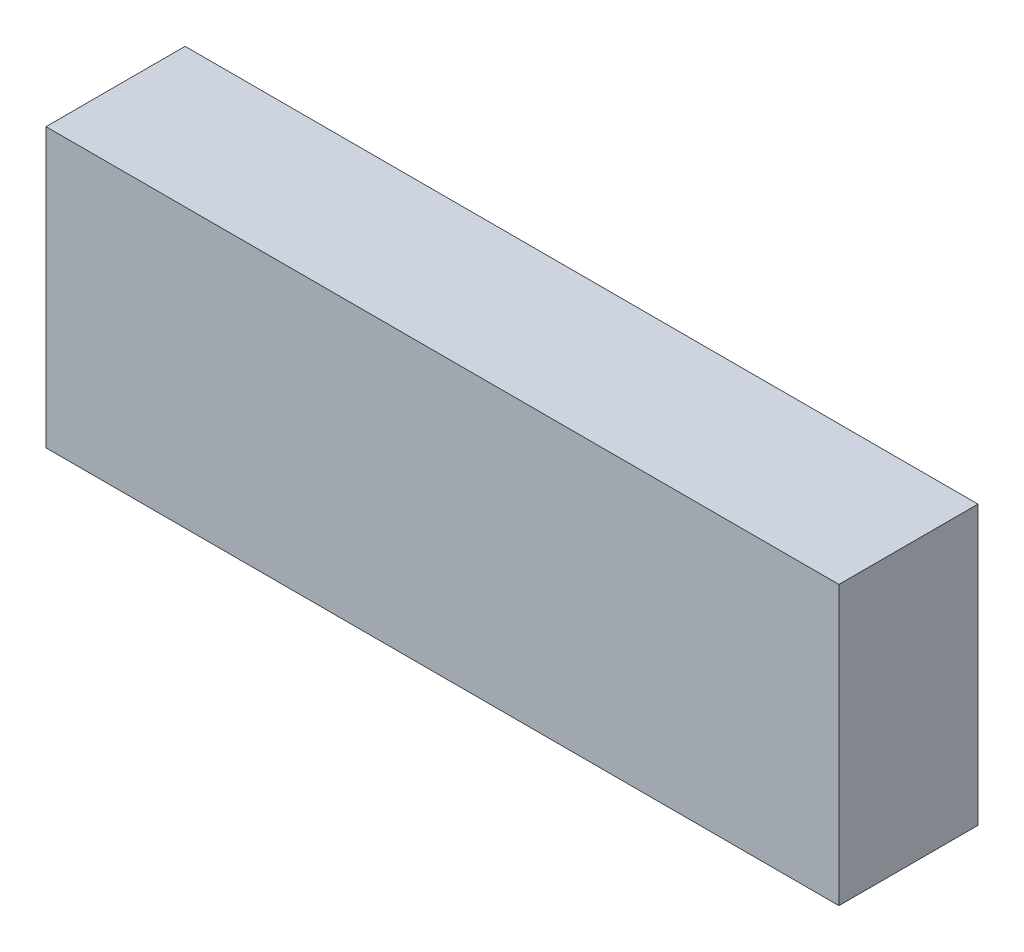
ISO-10303-21;
HEADER;
FILE_DESCRIPTION(('STEP AP214'),'2;1');
FILE_NAME('part.step','',(''),(''),'','','');
FILE_SCHEMA(('AUTOMOTIVE_DESIGN { 1 0 10303 214 1 1 1 1 }'));
ENDSEC;
DATA;
#1=APPLICATION_CONTEXT('core data for automotive mechanical design processes');
#2=APPLICATION_PROTOCOL_DEFINITION('international standard','automotive_design',2000,#1);
#3=PRODUCT_CONTEXT('',#1,'mechanical');
#4=PRODUCT('Part','Part','',(#3));
#5=PRODUCT_RELATED_PRODUCT_CATEGORY('part','',(#4));
#6=PRODUCT_DEFINITION_FORMATION('','',#4);
#7=PRODUCT_DEFINITION_CONTEXT('part definition',#1,'design');
#8=PRODUCT_DEFINITION('design','',#6,#7);
#9=PRODUCT_DEFINITION_SHAPE('','',#8);
#10=(LENGTH_UNIT() NAMED_UNIT(*) SI_UNIT(.MILLI.,.METRE.));
#11=(NAMED_UNIT(*) PLANE_ANGLE_UNIT() SI_UNIT($,.RADIAN.));
#12=(NAMED_UNIT(*) SI_UNIT($,.STERADIAN.) SOLID_ANGLE_UNIT());
#13=UNCERTAINTY_MEASURE_WITH_UNIT(LENGTH_MEASURE(1.E-05),#10,'distance_accuracy_value','');
#14=(GEOMETRIC_REPRESENTATION_CONTEXT(3) GLOBAL_UNCERTAINTY_ASSIGNED_CONTEXT((#13)) GLOBAL_UNIT_ASSIGNED_CONTEXT((#10,
#11,#12)) REPRESENTATION_CONTEXT('',''));
#15=CARTESIAN_POINT('',(0.,0.,0.));
#16=DIRECTION('',(0.,0.,1.));
#17=DIRECTION('',(1.,0.,0.));
#18=AXIS2_PLACEMENT_3D('',#15,#16,#17);
#19=CARTESIAN_POINT('',(0.,0.,10.));
#20=DIRECTION('',(1.,0.,0.));
#21=DIRECTION('',(0.,0.,-1.));
#22=AXIS2_PLACEMENT_3D('',#19,#20,#21);
#23=PLANE('',#22);
#24=DIRECTION('',(0.,-1.,0.));
#25=VECTOR('',#24,1.);
#26=CARTESIAN_POINT('',(0.,0.,0.));
#27=LINE('',#26,#25);
#28=CARTESIAN_POINT('',(0.,20.,0.));
#29=VERTEX_POINT('',#28);
#30=CARTESIAN_POINT('',(0.,0.,0.));
#31=VERTEX_POINT('',#30);
#32=EDGE_CURVE('E106',#29,#31,#27,.T.);
#33=ORIENTED_EDGE('',*,*,#32,.T.);
#34=DIRECTION('',(0.,0.,-1.));
#35=VECTOR('',#34,1.);
#36=CARTESIAN_POINT('',(0.,0.,10.));
#37=LINE('',#36,#35);
#38=CARTESIAN_POINT('',(0.,0.,10.));
#39=VERTEX_POINT('',#38);
#40=EDGE_CURVE('E11',#39,#31,#37,.T.);
#41=ORIENTED_EDGE('',*,*,#40,.F.);
#42=DIRECTION('',(0.,-1.,0.));
#43=VECTOR('',#42,1.);
#44=CARTESIAN_POINT('',(0.,0.,10.));
#45=LINE('',#44,#43);
#46=CARTESIAN_POINT('',(0.,20.,10.));
#47=VERTEX_POINT('',#46);
#48=EDGE_CURVE('E92',#47,#39,#45,.T.);
#49=ORIENTED_EDGE('',*,*,#48,.F.);
#50=DIRECTION('',(0.,0.,-1.));
#51=VECTOR('',#50,1.);
#52=CARTESIAN_POINT('',(0.,20.,10.));
#53=LINE('',#52,#51);
#54=EDGE_CURVE('E105',#47,#29,#53,.T.);
#55=ORIENTED_EDGE('',*,*,#54,.T.);
#56=EDGE_LOOP('',(#33,#41,#49,#55));
#57=FACE_BOUND('',#56,.T.);
#58=ADVANCED_FACE('F43',(#57),#23,.F.);
#59=CARTESIAN_POINT('',(0.,0.,10.));
#60=DIRECTION('',(0.,1.,0.));
#61=DIRECTION('',(0.,0.,1.));
#62=AXIS2_PLACEMENT_3D('',#59,#60,#61);
#63=PLANE('',#62);
#64=DIRECTION('',(1.,0.,0.));
#65=VECTOR('',#64,1.);
#66=CARTESIAN_POINT('',(0.,0.,0.));
#67=LINE('',#66,#65);
#68=CARTESIAN_POINT('',(57.,0.,0.));
#69=VERTEX_POINT('',#68);
#70=EDGE_CURVE('E97',#31,#69,#67,.T.);
#71=ORIENTED_EDGE('',*,*,#70,.T.);
#72=DIRECTION('',(0.,0.,-1.));
#73=VECTOR('',#72,1.);
#74=CARTESIAN_POINT('',(57.,0.,10.));
#75=LINE('',#74,#73);
#76=CARTESIAN_POINT('',(57.,0.,10.));
#77=VERTEX_POINT('',#76);
#78=EDGE_CURVE('E51',#77,#69,#75,.T.);
#79=ORIENTED_EDGE('',*,*,#78,.F.);
#80=DIRECTION('',(1.,0.,0.));
#81=VECTOR('',#80,1.);
#82=CARTESIAN_POINT('',(0.,0.,10.));
#83=LINE('',#82,#81);
#84=EDGE_CURVE('E87',#39,#77,#83,.T.);
#85=ORIENTED_EDGE('',*,*,#84,.F.);
#86=ORIENTED_EDGE('',*,*,#40,.T.);
#87=EDGE_LOOP('',(#71,#79,#85,#86));
#88=FACE_BOUND('',#87,.T.);
#89=ADVANCED_FACE('F100',(#88),#63,.F.);
#90=CARTESIAN_POINT('',(57.,0.,10.));
#91=DIRECTION('',(-1.,0.,0.));
#92=DIRECTION('',(0.,0.,1.));
#93=AXIS2_PLACEMENT_3D('',#90,#91,#92);
#94=PLANE('',#93);
#95=DIRECTION('',(0.,1.,0.));
#96=VECTOR('',#95,1.);
#97=CARTESIAN_POINT('',(57.,0.,0.));
#98=LINE('',#97,#96);
#99=CARTESIAN_POINT('',(57.,20.,0.));
#100=VERTEX_POINT('',#99);
#101=EDGE_CURVE('E78',#69,#100,#98,.T.);
#102=ORIENTED_EDGE('',*,*,#101,.T.);
#103=DIRECTION('',(0.,0.,-1.));
#104=VECTOR('',#103,1.);
#105=CARTESIAN_POINT('',(57.,20.,10.));
#106=LINE('',#105,#104);
#107=CARTESIAN_POINT('',(57.,20.,10.));
#108=VERTEX_POINT('',#107);
#109=EDGE_CURVE('E98',#108,#100,#106,.T.);
#110=ORIENTED_EDGE('',*,*,#109,.F.);
#111=DIRECTION('',(0.,1.,0.));
#112=VECTOR('',#111,1.);
#113=CARTESIAN_POINT('',(57.,0.,10.));
#114=LINE('',#113,#112);
#115=EDGE_CURVE('E95',#77,#108,#114,.T.);
#116=ORIENTED_EDGE('',*,*,#115,.F.);
#117=ORIENTED_EDGE('',*,*,#78,.T.);
#118=EDGE_LOOP('',(#102,#110,#116,#117));
#119=FACE_BOUND('',#118,.T.);
#120=ADVANCED_FACE('F99',(#119),#94,.F.);
#121=CARTESIAN_POINT('',(0.,20.,10.));
#122=DIRECTION('',(0.,-1.,0.));
#123=DIRECTION('',(0.,0.,-1.));
#124=AXIS2_PLACEMENT_3D('',#121,#122,#123);
#125=PLANE('',#124);
#126=DIRECTION('',(-1.,0.,0.));
#127=VECTOR('',#126,1.);
#128=CARTESIAN_POINT('',(0.,20.,0.));
#129=LINE('',#128,#127);
#130=EDGE_CURVE('E85',#100,#29,#129,.T.);
#131=ORIENTED_EDGE('',*,*,#130,.T.);
#132=ORIENTED_EDGE('',*,*,#54,.F.);
#133=DIRECTION('',(-1.,0.,0.));
#134=VECTOR('',#133,1.);
#135=CARTESIAN_POINT('',(0.,20.,10.));
#136=LINE('',#135,#134);
#137=EDGE_CURVE('E56',#108,#47,#136,.T.);
#138=ORIENTED_EDGE('',*,*,#137,.F.);
#139=ORIENTED_EDGE('',*,*,#109,.T.);
#140=EDGE_LOOP('',(#131,#132,#138,#139));
#141=FACE_BOUND('',#140,.T.);
#142=ADVANCED_FACE('F111',(#141),#125,.F.);
#143=CARTESIAN_POINT('',(0.,0.,10.));
#144=DIRECTION('',(0.,0.,-1.));
#145=DIRECTION('',(-1.,0.,0.));
#146=AXIS2_PLACEMENT_3D('',#143,#144,#145);
#147=PLANE('',#146);
#148=ORIENTED_EDGE('',*,*,#48,.T.);
#149=ORIENTED_EDGE('',*,*,#84,.T.);
#150=ORIENTED_EDGE('',*,*,#115,.T.);
#151=ORIENTED_EDGE('',*,*,#137,.T.);
#152=EDGE_LOOP('',(#148,#149,#150,#151));
#153=FACE_BOUND('',#152,.T.);
#154=ADVANCED_FACE('F89',(#153),#147,.F.);
#155=CARTESIAN_POINT('',(0.,0.,0.));
#156=DIRECTION('',(0.,0.,-1.));
#157=DIRECTION('',(-1.,0.,0.));
#158=AXIS2_PLACEMENT_3D('',#155,#156,#157);
#159=PLANE('',#158);
#160=ORIENTED_EDGE('',*,*,#32,.F.);
#161=ORIENTED_EDGE('',*,*,#130,.F.);
#162=ORIENTED_EDGE('',*,*,#101,.F.);
#163=ORIENTED_EDGE('',*,*,#70,.F.);
#164=EDGE_LOOP('',(#160,#161,#162,#163));
#165=FACE_BOUND('',#164,.T.);
#166=ADVANCED_FACE('F116',(#165),#159,.T.);
#167=CLOSED_SHELL('',(#58,#89,#120,#142,#154,#166));
#168=MANIFOLD_SOLID_BREP('B2',#167);
#169=ADVANCED_BREP_SHAPE_REPRESENTATION('',(#18,#168),#14);
#170=SHAPE_DEFINITION_REPRESENTATION(#9,#169);
ENDSEC;
END-ISO-10303-21;
